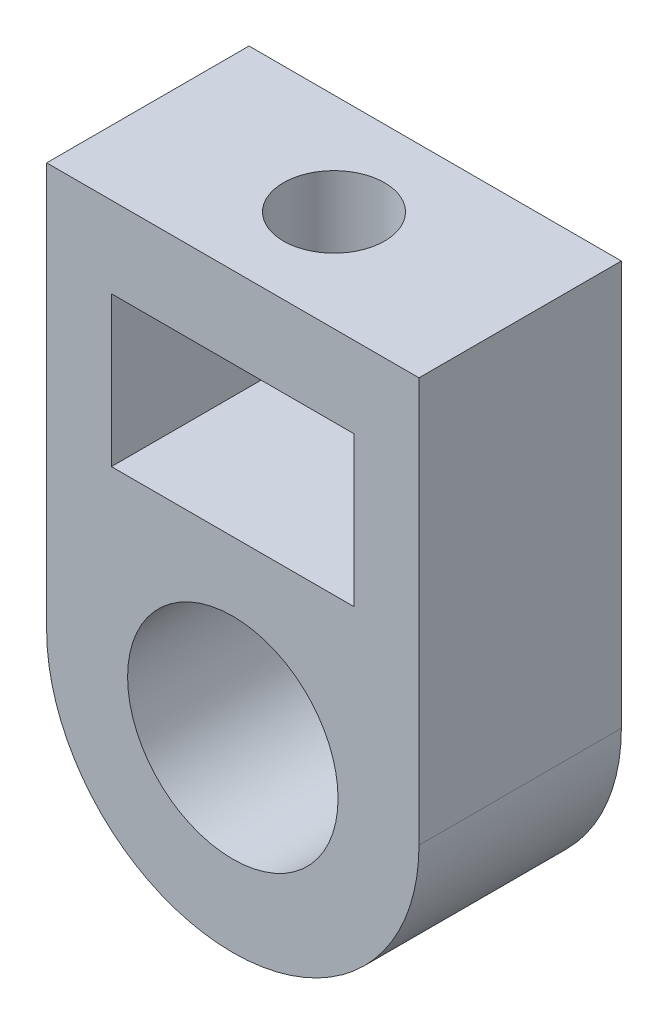
ISO-10303-21;
HEADER;
FILE_DESCRIPTION(('STEP AP214'),'2;1');
FILE_NAME('part.step','',(''),(''),'','','');
FILE_SCHEMA(('AUTOMOTIVE_DESIGN { 1 0 10303 214 1 1 1 1 }'));
ENDSEC;
DATA;
#1=APPLICATION_CONTEXT('core data for automotive mechanical design processes');
#2=APPLICATION_PROTOCOL_DEFINITION('international standard','automotive_design',2000,#1);
#3=PRODUCT_CONTEXT('',#1,'mechanical');
#4=PRODUCT('Part','Part','',(#3));
#5=PRODUCT_RELATED_PRODUCT_CATEGORY('part','',(#4));
#6=PRODUCT_DEFINITION_FORMATION('','',#4);
#7=PRODUCT_DEFINITION_CONTEXT('part definition',#1,'design');
#8=PRODUCT_DEFINITION('design','',#6,#7);
#9=PRODUCT_DEFINITION_SHAPE('','',#8);
#10=(LENGTH_UNIT() NAMED_UNIT(*) SI_UNIT(.MILLI.,.METRE.));
#11=(NAMED_UNIT(*) PLANE_ANGLE_UNIT() SI_UNIT($,.RADIAN.));
#12=(NAMED_UNIT(*) SI_UNIT($,.STERADIAN.) SOLID_ANGLE_UNIT());
#13=UNCERTAINTY_MEASURE_WITH_UNIT(LENGTH_MEASURE(1.E-05),#10,'distance_accuracy_value','');
#14=(GEOMETRIC_REPRESENTATION_CONTEXT(3) GLOBAL_UNCERTAINTY_ASSIGNED_CONTEXT((#13)) GLOBAL_UNIT_ASSIGNED_CONTEXT((#10,
#11,#12)) REPRESENTATION_CONTEXT('',''));
#15=CARTESIAN_POINT('',(0.,0.,0.));
#16=DIRECTION('',(0.,0.,1.));
#17=DIRECTION('',(1.,0.,0.));
#18=AXIS2_PLACEMENT_3D('',#15,#16,#17);
#19=CARTESIAN_POINT('',(-4.6,0.,5.));
#20=DIRECTION('',(-1.,0.,0.));
#21=DIRECTION('',(0.,0.,1.));
#22=AXIS2_PLACEMENT_3D('',#19,#20,#21);
#23=PLANE('',#22);
#24=DIRECTION('',(0.,1.,0.));
#25=VECTOR('',#24,1.);
#26=CARTESIAN_POINT('',(-4.6,0.,0.));
#27=LINE('',#26,#25);
#28=CARTESIAN_POINT('',(-4.6,0.,0.));
#29=VERTEX_POINT('',#28);
#30=CARTESIAN_POINT('',(-4.6,10.,0.));
#31=VERTEX_POINT('',#30);
#32=EDGE_CURVE('E156',#29,#31,#27,.T.);
#33=ORIENTED_EDGE('',*,*,#32,.F.);
#34=DIRECTION('',(0.,0.,-1.));
#35=VECTOR('',#34,1.);
#36=CARTESIAN_POINT('',(-4.6,0.,5.));
#37=LINE('',#36,#35);
#38=CARTESIAN_POINT('',(-4.6,0.,5.));
#39=VERTEX_POINT('',#38);
#40=EDGE_CURVE('E11',#39,#29,#37,.T.);
#41=ORIENTED_EDGE('',*,*,#40,.F.);
#42=DIRECTION('',(0.,1.,0.));
#43=VECTOR('',#42,1.);
#44=CARTESIAN_POINT('',(-4.6,0.,5.));
#45=LINE('',#44,#43);
#46=CARTESIAN_POINT('',(-4.6,10.,5.));
#47=VERTEX_POINT('',#46);
#48=EDGE_CURVE('E141',#39,#47,#45,.T.);
#49=ORIENTED_EDGE('',*,*,#48,.T.);
#50=DIRECTION('',(0.,0.,-1.));
#51=VECTOR('',#50,1.);
#52=CARTESIAN_POINT('',(-4.6,10.,5.));
#53=LINE('',#52,#51);
#54=EDGE_CURVE('E153',#47,#31,#53,.T.);
#55=ORIENTED_EDGE('',*,*,#54,.T.);
#56=EDGE_LOOP('',(#33,#41,#49,#55));
#57=FACE_BOUND('',#56,.T.);
#58=ADVANCED_FACE('F35',(#57),#23,.T.);
#59=CARTESIAN_POINT('',(0.,0.,5.));
#60=DIRECTION('',(0.,0.,-1.));
#61=DIRECTION('',(-1.,0.,0.));
#62=AXIS2_PLACEMENT_3D('',#59,#60,#61);
#63=CYLINDRICAL_SURFACE('',#62,4.6);
#64=CARTESIAN_POINT('',(0.,0.,0.));
#65=DIRECTION('',(0.,0.,1.));
#66=DIRECTION('',(1.,0.,0.));
#67=AXIS2_PLACEMENT_3D('',#64,#65,#66);
#68=CIRCLE('',#67,4.6);
#69=CARTESIAN_POINT('',(4.6,0.,0.));
#70=VERTEX_POINT('',#69);
#71=EDGE_CURVE('E159',#29,#70,#68,.T.);
#72=ORIENTED_EDGE('',*,*,#71,.T.);
#73=DIRECTION('',(0.,0.,-1.));
#74=VECTOR('',#73,1.);
#75=CARTESIAN_POINT('',(4.6,0.,5.));
#76=LINE('',#75,#74);
#77=CARTESIAN_POINT('',(4.6,0.,5.));
#78=VERTEX_POINT('',#77);
#79=EDGE_CURVE('E43',#78,#70,#76,.T.);
#80=ORIENTED_EDGE('',*,*,#79,.F.);
#81=CARTESIAN_POINT('',(0.,0.,5.));
#82=DIRECTION('',(0.,0.,1.));
#83=DIRECTION('',(1.,0.,0.));
#84=AXIS2_PLACEMENT_3D('',#81,#82,#83);
#85=CIRCLE('',#84,4.6);
#86=EDGE_CURVE('E145',#39,#78,#85,.T.);
#87=ORIENTED_EDGE('',*,*,#86,.F.);
#88=ORIENTED_EDGE('',*,*,#40,.T.);
#89=EDGE_LOOP('',(#72,#80,#87,#88));
#90=FACE_BOUND('',#89,.T.);
#91=ADVANCED_FACE('F177',(#90),#63,.T.);
#92=CARTESIAN_POINT('',(4.6,0.,5.));
#93=DIRECTION('',(1.,0.,0.));
#94=DIRECTION('',(0.,1.,0.));
#95=AXIS2_PLACEMENT_3D('',#92,#93,#94);
#96=PLANE('',#95);
#97=DIRECTION('',(0.,-1.,0.));
#98=VECTOR('',#97,1.);
#99=CARTESIAN_POINT('',(4.6,0.,0.));
#100=LINE('',#99,#98);
#101=CARTESIAN_POINT('',(4.6,10.,0.));
#102=VERTEX_POINT('',#101);
#103=EDGE_CURVE('E162',#102,#70,#100,.T.);
#104=ORIENTED_EDGE('',*,*,#103,.F.);
#105=DIRECTION('',(0.,0.,-1.));
#106=VECTOR('',#105,1.);
#107=CARTESIAN_POINT('',(4.6,10.,5.));
#108=LINE('',#107,#106);
#109=CARTESIAN_POINT('',(4.6,10.,5.));
#110=VERTEX_POINT('',#109);
#111=EDGE_CURVE('E168',#110,#102,#108,.T.);
#112=ORIENTED_EDGE('',*,*,#111,.F.);
#113=DIRECTION('',(0.,-1.,0.));
#114=VECTOR('',#113,1.);
#115=CARTESIAN_POINT('',(4.6,0.,5.));
#116=LINE('',#115,#114);
#117=EDGE_CURVE('E147',#110,#78,#116,.T.);
#118=ORIENTED_EDGE('',*,*,#117,.T.);
#119=ORIENTED_EDGE('',*,*,#79,.T.);
#120=EDGE_LOOP('',(#104,#112,#118,#119));
#121=FACE_BOUND('',#120,.T.);
#122=ADVANCED_FACE('F172',(#121),#96,.T.);
#123=CARTESIAN_POINT('',(0.,0.,5.));
#124=DIRECTION('',(0.,0.,-1.));
#125=DIRECTION('',(-1.,0.,0.));
#126=AXIS2_PLACEMENT_3D('',#123,#124,#125);
#127=CYLINDRICAL_SURFACE('',#126,2.6);
#128=CARTESIAN_POINT('',(0.,0.,5.));
#129=DIRECTION('',(0.,0.,1.));
#130=DIRECTION('',(1.,0.,0.));
#131=AXIS2_PLACEMENT_3D('',#128,#129,#130);
#132=CIRCLE('',#131,2.6);
#133=CARTESIAN_POINT('',(2.6,0.,5.));
#134=VERTEX_POINT('',#133);
#135=EDGE_CURVE('E138',#134,#134,#132,.T.);
#136=ORIENTED_EDGE('',*,*,#135,.T.);
#137=EDGE_LOOP('',(#136));
#138=FACE_BOUND('',#137,.T.);
#139=CARTESIAN_POINT('',(0.,0.,0.));
#140=DIRECTION('',(0.,0.,1.));
#141=DIRECTION('',(1.,0.,0.));
#142=AXIS2_PLACEMENT_3D('',#139,#140,#141);
#143=CIRCLE('',#142,2.6);
#144=CARTESIAN_POINT('',(2.6,0.,0.));
#145=VERTEX_POINT('',#144);
#146=EDGE_CURVE('E137',#145,#145,#143,.T.);
#147=ORIENTED_EDGE('',*,*,#146,.F.);
#148=EDGE_LOOP('',(#147));
#149=FACE_BOUND('',#148,.T.);
#150=ADVANCED_FACE('F37',(#138,#149),#127,.F.);
#151=CARTESIAN_POINT('',(0.,10.,5.));
#152=DIRECTION('',(0.,1.,0.));
#153=DIRECTION('',(0.,0.,1.));
#154=AXIS2_PLACEMENT_3D('',#151,#152,#153);
#155=PLANE('',#154);
#156=CARTESIAN_POINT('',(0.,10.,2.5));
#157=DIRECTION('',(0.,1.,0.));
#158=DIRECTION('',(0.,0.,1.));
#159=AXIS2_PLACEMENT_3D('',#156,#157,#158);
#160=CIRCLE('',#159,1.25);
#161=CARTESIAN_POINT('',(0.,10.,3.75));
#162=VERTEX_POINT('',#161);
#163=EDGE_CURVE('E134',#162,#162,#160,.T.);
#164=ORIENTED_EDGE('',*,*,#163,.F.);
#165=EDGE_LOOP('',(#164));
#166=FACE_BOUND('',#165,.T.);
#167=DIRECTION('',(1.,0.,0.));
#168=VECTOR('',#167,1.);
#169=CARTESIAN_POINT('',(0.,10.,0.));
#170=LINE('',#169,#168);
#171=EDGE_CURVE('E142',#31,#102,#170,.T.);
#172=ORIENTED_EDGE('',*,*,#171,.F.);
#173=ORIENTED_EDGE('',*,*,#54,.F.);
#174=DIRECTION('',(1.,0.,0.));
#175=VECTOR('',#174,1.);
#176=CARTESIAN_POINT('',(0.,10.,5.));
#177=LINE('',#176,#175);
#178=EDGE_CURVE('E150',#47,#110,#177,.T.);
#179=ORIENTED_EDGE('',*,*,#178,.T.);
#180=ORIENTED_EDGE('',*,*,#111,.T.);
#181=EDGE_LOOP('',(#172,#173,#179,#180));
#182=FACE_BOUND('',#181,.T.);
#183=ADVANCED_FACE('F183',(#166,#182),#155,.T.);
#184=CARTESIAN_POINT('',(0.,0.,5.));
#185=DIRECTION('',(0.,0.,1.));
#186=DIRECTION('',(1.,0.,0.));
#187=AXIS2_PLACEMENT_3D('',#184,#185,#186);
#188=PLANE('',#187);
#189=DIRECTION('',(0.,1.,0.));
#190=VECTOR('',#189,1.);
#191=CARTESIAN_POINT('',(3.,8.,5.));
#192=LINE('',#191,#190);
#193=CARTESIAN_POINT('',(3.,4.3,5.));
#194=VERTEX_POINT('',#193);
#195=CARTESIAN_POINT('',(3.,8.,5.));
#196=VERTEX_POINT('',#195);
#197=EDGE_CURVE('E50',#194,#196,#192,.T.);
#198=ORIENTED_EDGE('',*,*,#197,.F.);
#199=DIRECTION('',(1.,0.,0.));
#200=VECTOR('',#199,1.);
#201=CARTESIAN_POINT('',(-3.,4.3,5.));
#202=LINE('',#201,#200);
#203=CARTESIAN_POINT('',(-3.,4.3,5.));
#204=VERTEX_POINT('',#203);
#205=EDGE_CURVE('E119',#204,#194,#202,.T.);
#206=ORIENTED_EDGE('',*,*,#205,.F.);
#207=DIRECTION('',(0.,-1.,0.));
#208=VECTOR('',#207,1.);
#209=CARTESIAN_POINT('',(-3.,8.,5.));
#210=LINE('',#209,#208);
#211=CARTESIAN_POINT('',(-3.,8.,5.));
#212=VERTEX_POINT('',#211);
#213=EDGE_CURVE('E102',#212,#204,#210,.T.);
#214=ORIENTED_EDGE('',*,*,#213,.F.);
#215=DIRECTION('',(-1.,0.,0.));
#216=VECTOR('',#215,1.);
#217=CARTESIAN_POINT('',(-3.,8.,5.));
#218=LINE('',#217,#216);
#219=EDGE_CURVE('E111',#196,#212,#218,.T.);
#220=ORIENTED_EDGE('',*,*,#219,.F.);
#221=EDGE_LOOP('',(#198,#206,#214,#220));
#222=FACE_BOUND('',#221,.T.);
#223=ORIENTED_EDGE('',*,*,#135,.F.);
#224=EDGE_LOOP('',(#223));
#225=FACE_BOUND('',#224,.T.);
#226=ORIENTED_EDGE('',*,*,#48,.F.);
#227=ORIENTED_EDGE('',*,*,#86,.T.);
#228=ORIENTED_EDGE('',*,*,#117,.F.);
#229=ORIENTED_EDGE('',*,*,#178,.F.);
#230=EDGE_LOOP('',(#226,#227,#228,#229));
#231=FACE_BOUND('',#230,.T.);
#232=ADVANCED_FACE('F116',(#222,#225,#231),#188,.T.);
#233=CARTESIAN_POINT('',(0.,0.,0.));
#234=DIRECTION('',(0.,0.,1.));
#235=DIRECTION('',(1.,0.,0.));
#236=AXIS2_PLACEMENT_3D('',#233,#234,#235);
#237=PLANE('',#236);
#238=DIRECTION('',(-1.,0.,0.));
#239=VECTOR('',#238,1.);
#240=CARTESIAN_POINT('',(-3.,4.3,0.));
#241=LINE('',#240,#239);
#242=CARTESIAN_POINT('',(3.,4.3,0.));
#243=VERTEX_POINT('',#242);
#244=CARTESIAN_POINT('',(-3.,4.3,0.));
#245=VERTEX_POINT('',#244);
#246=EDGE_CURVE('E222',#243,#245,#241,.T.);
#247=ORIENTED_EDGE('',*,*,#246,.F.);
#248=DIRECTION('',(0.,-1.,0.));
#249=VECTOR('',#248,1.);
#250=CARTESIAN_POINT('',(3.,8.,0.));
#251=LINE('',#250,#249);
#252=CARTESIAN_POINT('',(3.,8.,0.));
#253=VERTEX_POINT('',#252);
#254=EDGE_CURVE('E131',#253,#243,#251,.T.);
#255=ORIENTED_EDGE('',*,*,#254,.F.);
#256=DIRECTION('',(1.,0.,0.));
#257=VECTOR('',#256,1.);
#258=CARTESIAN_POINT('',(-3.,8.,0.));
#259=LINE('',#258,#257);
#260=CARTESIAN_POINT('',(-3.,8.,0.));
#261=VERTEX_POINT('',#260);
#262=EDGE_CURVE('E128',#261,#253,#259,.T.);
#263=ORIENTED_EDGE('',*,*,#262,.F.);
#264=DIRECTION('',(0.,1.,0.));
#265=VECTOR('',#264,1.);
#266=CARTESIAN_POINT('',(-3.,8.,0.));
#267=LINE('',#266,#265);
#268=EDGE_CURVE('E105',#245,#261,#267,.T.);
#269=ORIENTED_EDGE('',*,*,#268,.F.);
#270=EDGE_LOOP('',(#247,#255,#263,#269));
#271=FACE_BOUND('',#270,.T.);
#272=ORIENTED_EDGE('',*,*,#146,.T.);
#273=EDGE_LOOP('',(#272));
#274=FACE_BOUND('',#273,.T.);
#275=ORIENTED_EDGE('',*,*,#32,.T.);
#276=ORIENTED_EDGE('',*,*,#171,.T.);
#277=ORIENTED_EDGE('',*,*,#103,.T.);
#278=ORIENTED_EDGE('',*,*,#71,.F.);
#279=EDGE_LOOP('',(#275,#276,#277,#278));
#280=FACE_BOUND('',#279,.T.);
#281=ADVANCED_FACE('F180',(#271,#274,#280),#237,.F.);
#282=CARTESIAN_POINT('',(0.,8.,2.5));
#283=DIRECTION('',(0.,1.,0.));
#284=DIRECTION('',(0.,0.,1.));
#285=AXIS2_PLACEMENT_3D('',#282,#283,#284);
#286=CYLINDRICAL_SURFACE('',#285,1.25);
#287=CARTESIAN_POINT('',(0.,8.,2.5));
#288=DIRECTION('',(0.,1.,0.));
#289=DIRECTION('',(0.,0.,1.));
#290=AXIS2_PLACEMENT_3D('',#287,#288,#289);
#291=CIRCLE('',#290,1.25);
#292=CARTESIAN_POINT('',(0.,8.,3.75));
#293=VERTEX_POINT('',#292);
#294=EDGE_CURVE('E130',#293,#293,#291,.F.);
#295=ORIENTED_EDGE('',*,*,#294,.T.);
#296=EDGE_LOOP('',(#295));
#297=FACE_BOUND('',#296,.T.);
#298=ORIENTED_EDGE('',*,*,#163,.T.);
#299=EDGE_LOOP('',(#298));
#300=FACE_BOUND('',#299,.T.);
#301=ADVANCED_FACE('F201',(#297,#300),#286,.F.);
#302=CARTESIAN_POINT('',(-3.,8.,-7.04911341943084));
#303=DIRECTION('',(0.,1.,0.));
#304=DIRECTION('',(0.,0.,1.));
#305=AXIS2_PLACEMENT_3D('',#302,#303,#304);
#306=PLANE('',#305);
#307=ORIENTED_EDGE('',*,*,#262,.T.);
#308=DIRECTION('',(0.,0.,1.));
#309=VECTOR('',#308,1.);
#310=CARTESIAN_POINT('',(3.,8.,-7.04911341943084));
#311=LINE('',#310,#309);
#312=EDGE_CURVE('E108',#253,#196,#311,.T.);
#313=ORIENTED_EDGE('',*,*,#312,.T.);
#314=ORIENTED_EDGE('',*,*,#219,.T.);
#315=DIRECTION('',(0.,0.,1.));
#316=VECTOR('',#315,1.);
#317=CARTESIAN_POINT('',(-3.,8.,-7.04911341943084));
#318=LINE('',#317,#316);
#319=EDGE_CURVE('E58',#261,#212,#318,.T.);
#320=ORIENTED_EDGE('',*,*,#319,.F.);
#321=EDGE_LOOP('',(#307,#313,#314,#320));
#322=FACE_BOUND('',#321,.T.);
#323=ORIENTED_EDGE('',*,*,#294,.F.);
#324=EDGE_LOOP('',(#323));
#325=FACE_BOUND('',#324,.T.);
#326=ADVANCED_FACE('F112',(#322,#325),#306,.F.);
#327=CARTESIAN_POINT('',(3.,8.,-7.04911341943084));
#328=DIRECTION('',(1.,0.,0.));
#329=DIRECTION('',(0.,1.,0.));
#330=AXIS2_PLACEMENT_3D('',#327,#328,#329);
#331=PLANE('',#330);
#332=ORIENTED_EDGE('',*,*,#254,.T.);
#333=DIRECTION('',(0.,0.,1.));
#334=VECTOR('',#333,1.);
#335=CARTESIAN_POINT('',(3.,4.3,-7.04911341943084));
#336=LINE('',#335,#334);
#337=EDGE_CURVE('E124',#243,#194,#336,.T.);
#338=ORIENTED_EDGE('',*,*,#337,.T.);
#339=ORIENTED_EDGE('',*,*,#197,.T.);
#340=ORIENTED_EDGE('',*,*,#312,.F.);
#341=EDGE_LOOP('',(#332,#338,#339,#340));
#342=FACE_BOUND('',#341,.T.);
#343=ADVANCED_FACE('F208',(#342),#331,.F.);
#344=CARTESIAN_POINT('',(-3.,4.3,-7.04911341943084));
#345=DIRECTION('',(0.,-1.,0.));
#346=DIRECTION('',(0.,0.,-1.));
#347=AXIS2_PLACEMENT_3D('',#344,#345,#346);
#348=PLANE('',#347);
#349=ORIENTED_EDGE('',*,*,#246,.T.);
#350=DIRECTION('',(0.,0.,1.));
#351=VECTOR('',#350,1.);
#352=CARTESIAN_POINT('',(-3.,4.3,-7.04911341943084));
#353=LINE('',#352,#351);
#354=EDGE_CURVE('E107',#245,#204,#353,.T.);
#355=ORIENTED_EDGE('',*,*,#354,.T.);
#356=ORIENTED_EDGE('',*,*,#205,.T.);
#357=ORIENTED_EDGE('',*,*,#337,.F.);
#358=EDGE_LOOP('',(#349,#355,#356,#357));
#359=FACE_BOUND('',#358,.T.);
#360=ADVANCED_FACE('F211',(#359),#348,.F.);
#361=CARTESIAN_POINT('',(-3.,8.,-7.04911341943084));
#362=DIRECTION('',(-1.,0.,0.));
#363=DIRECTION('',(0.,-1.,0.));
#364=AXIS2_PLACEMENT_3D('',#361,#362,#363);
#365=PLANE('',#364);
#366=ORIENTED_EDGE('',*,*,#268,.T.);
#367=ORIENTED_EDGE('',*,*,#319,.T.);
#368=ORIENTED_EDGE('',*,*,#213,.T.);
#369=ORIENTED_EDGE('',*,*,#354,.F.);
#370=EDGE_LOOP('',(#366,#367,#368,#369));
#371=FACE_BOUND('',#370,.T.);
#372=ADVANCED_FACE('F99',(#371),#365,.F.);
#373=CLOSED_SHELL('',(#58,#91,#122,#150,#183,#232,#281,#301,#326,#343,#360,#372));
#374=MANIFOLD_SOLID_BREP('B2',#373);
#375=ADVANCED_BREP_SHAPE_REPRESENTATION('',(#18,#374),#14);
#376=SHAPE_DEFINITION_REPRESENTATION(#9,#375);
ENDSEC;
END-ISO-10303-21;
